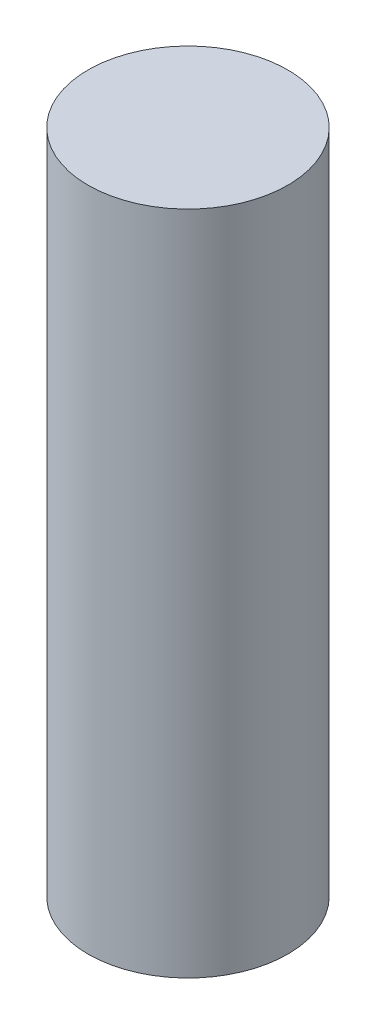
ISO-10303-21;
HEADER;
FILE_DESCRIPTION(('STEP AP214'),'2;1');
FILE_NAME('part.step','',(''),(''),'','','');
FILE_SCHEMA(('AUTOMOTIVE_DESIGN { 1 0 10303 214 1 1 1 1 }'));
ENDSEC;
DATA;
#1=APPLICATION_CONTEXT('core data for automotive mechanical design processes');
#2=APPLICATION_PROTOCOL_DEFINITION('international standard','automotive_design',2000,#1);
#3=PRODUCT_CONTEXT('',#1,'mechanical');
#4=PRODUCT('Part','Part','',(#3));
#5=PRODUCT_RELATED_PRODUCT_CATEGORY('part','',(#4));
#6=PRODUCT_DEFINITION_FORMATION('','',#4);
#7=PRODUCT_DEFINITION_CONTEXT('part definition',#1,'design');
#8=PRODUCT_DEFINITION('design','',#6,#7);
#9=PRODUCT_DEFINITION_SHAPE('','',#8);
#10=(LENGTH_UNIT() NAMED_UNIT(*) SI_UNIT(.MILLI.,.METRE.));
#11=(NAMED_UNIT(*) PLANE_ANGLE_UNIT() SI_UNIT($,.RADIAN.));
#12=(NAMED_UNIT(*) SI_UNIT($,.STERADIAN.) SOLID_ANGLE_UNIT());
#13=UNCERTAINTY_MEASURE_WITH_UNIT(LENGTH_MEASURE(1.E-05),#10,'distance_accuracy_value','');
#14=(GEOMETRIC_REPRESENTATION_CONTEXT(3) GLOBAL_UNCERTAINTY_ASSIGNED_CONTEXT((#13)) GLOBAL_UNIT_ASSIGNED_CONTEXT((#10,
#11,#12)) REPRESENTATION_CONTEXT('',''));
#15=CARTESIAN_POINT('',(0.,0.,0.));
#16=DIRECTION('',(0.,0.,1.));
#17=DIRECTION('',(1.,0.,0.));
#18=AXIS2_PLACEMENT_3D('',#15,#16,#17);
#19=CARTESIAN_POINT('',(0.,63.5,0.));
#20=DIRECTION('',(0.,-1.,0.));
#21=DIRECTION('',(0.,0.,-1.));
#22=AXIS2_PLACEMENT_3D('',#19,#20,#21);
#23=CYLINDRICAL_SURFACE('',#22,9.525);
#24=CARTESIAN_POINT('',(0.,63.5,0.));
#25=DIRECTION('',(0.,1.,0.));
#26=DIRECTION('',(0.,0.,1.));
#27=AXIS2_PLACEMENT_3D('',#24,#25,#26);
#28=CIRCLE('',#27,9.525);
#29=CARTESIAN_POINT('',(0.,63.5,9.525));
#30=VERTEX_POINT('',#29);
#31=EDGE_CURVE('E10',#30,#30,#28,.T.);
#32=ORIENTED_EDGE('',*,*,#31,.F.);
#33=EDGE_LOOP('',(#32));
#34=FACE_BOUND('',#33,.T.);
#35=CARTESIAN_POINT('',(0.,0.,0.));
#36=DIRECTION('',(0.,1.,0.));
#37=DIRECTION('',(0.,0.,1.));
#38=AXIS2_PLACEMENT_3D('',#35,#36,#37);
#39=CIRCLE('',#38,9.525);
#40=CARTESIAN_POINT('',(0.,0.,9.525));
#41=VERTEX_POINT('',#40);
#42=EDGE_CURVE('E34',#41,#41,#39,.T.);
#43=ORIENTED_EDGE('',*,*,#42,.T.);
#44=EDGE_LOOP('',(#43));
#45=FACE_BOUND('',#44,.T.);
#46=ADVANCED_FACE('F31',(#34,#45),#23,.T.);
#47=CARTESIAN_POINT('',(0.,63.5,0.));
#48=DIRECTION('',(0.,1.,0.));
#49=DIRECTION('',(0.,0.,1.));
#50=AXIS2_PLACEMENT_3D('',#47,#48,#49);
#51=PLANE('',#50);
#52=ORIENTED_EDGE('',*,*,#31,.T.);
#53=EDGE_LOOP('',(#52));
#54=FACE_BOUND('',#53,.T.);
#55=ADVANCED_FACE('F46',(#54),#51,.T.);
#56=CARTESIAN_POINT('',(0.,0.,0.));
#57=DIRECTION('',(0.,1.,0.));
#58=DIRECTION('',(0.,0.,1.));
#59=AXIS2_PLACEMENT_3D('',#56,#57,#58);
#60=PLANE('',#59);
#61=ORIENTED_EDGE('',*,*,#42,.F.);
#62=EDGE_LOOP('',(#61));
#63=FACE_BOUND('',#62,.T.);
#64=ADVANCED_FACE('F44',(#63),#60,.F.);
#65=CLOSED_SHELL('',(#46,#55,#64));
#66=MANIFOLD_SOLID_BREP('B2',#65);
#67=ADVANCED_BREP_SHAPE_REPRESENTATION('',(#18,#66),#14);
#68=SHAPE_DEFINITION_REPRESENTATION(#9,#67);
ENDSEC;
END-ISO-10303-21;
